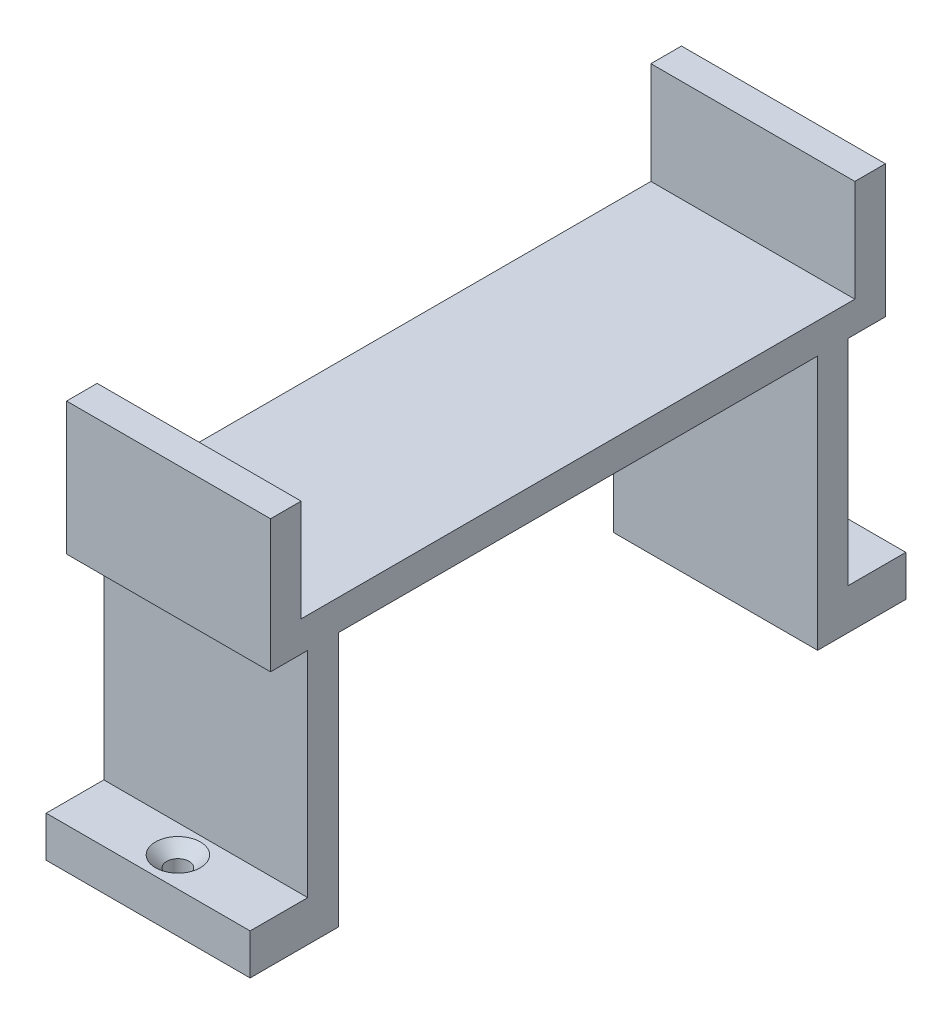
ISO-10303-21;
HEADER;
FILE_DESCRIPTION(('STEP AP214'),'2;1');
FILE_NAME('part.step','',(''),(''),'','','');
FILE_SCHEMA(('AUTOMOTIVE_DESIGN { 1 0 10303 214 1 1 1 1 }'));
ENDSEC;
DATA;
#1=APPLICATION_CONTEXT('core data for automotive mechanical design processes');
#2=APPLICATION_PROTOCOL_DEFINITION('international standard','automotive_design',2000,#1);
#3=PRODUCT_CONTEXT('',#1,'mechanical');
#4=PRODUCT('Part','Part','',(#3));
#5=PRODUCT_RELATED_PRODUCT_CATEGORY('part','',(#4));
#6=PRODUCT_DEFINITION_FORMATION('','',#4);
#7=PRODUCT_DEFINITION_CONTEXT('part definition',#1,'design');
#8=PRODUCT_DEFINITION('design','',#6,#7);
#9=PRODUCT_DEFINITION_SHAPE('','',#8);
#10=(LENGTH_UNIT() NAMED_UNIT(*) SI_UNIT(.MILLI.,.METRE.));
#11=(NAMED_UNIT(*) PLANE_ANGLE_UNIT() SI_UNIT($,.RADIAN.));
#12=(NAMED_UNIT(*) SI_UNIT($,.STERADIAN.) SOLID_ANGLE_UNIT());
#13=UNCERTAINTY_MEASURE_WITH_UNIT(LENGTH_MEASURE(1.E-05),#10,'distance_accuracy_value','');
#14=(GEOMETRIC_REPRESENTATION_CONTEXT(3) GLOBAL_UNCERTAINTY_ASSIGNED_CONTEXT((#13)) GLOBAL_UNIT_ASSIGNED_CONTEXT((#10,
#11,#12)) REPRESENTATION_CONTEXT('',''));
#15=CARTESIAN_POINT('',(0.,0.,0.));
#16=DIRECTION('',(0.,0.,1.));
#17=DIRECTION('',(1.,0.,0.));
#18=AXIS2_PLACEMENT_3D('',#15,#16,#17);
#19=CARTESIAN_POINT('',(10.,19.,30.15));
#20=DIRECTION('',(0.,0.,-1.));
#21=DIRECTION('',(0.,1.,0.));
#22=AXIS2_PLACEMENT_3D('',#19,#20,#21);
#23=PLANE('',#22);
#24=DIRECTION('',(0.,-1.,0.));
#25=VECTOR('',#24,1.);
#26=CARTESIAN_POINT('',(-10.,19.,30.15));
#27=LINE('',#26,#25);
#28=CARTESIAN_POINT('',(-10.,19.,30.15));
#29=VERTEX_POINT('',#28);
#30=CARTESIAN_POINT('',(-10.,6.,30.15));
#31=VERTEX_POINT('',#30);
#32=EDGE_CURVE('E207',#29,#31,#27,.T.);
#33=ORIENTED_EDGE('',*,*,#32,.T.);
#34=DIRECTION('',(-1.,0.,0.));
#35=VECTOR('',#34,1.);
#36=CARTESIAN_POINT('',(0.,6.,30.15));
#37=LINE('',#36,#35);
#38=CARTESIAN_POINT('',(10.,6.,30.15));
#39=VERTEX_POINT('',#38);
#40=EDGE_CURVE('E114',#39,#31,#37,.T.);
#41=ORIENTED_EDGE('',*,*,#40,.F.);
#42=DIRECTION('',(0.,-1.,0.));
#43=VECTOR('',#42,1.);
#44=CARTESIAN_POINT('',(10.,19.,30.15));
#45=LINE('',#44,#43);
#46=CARTESIAN_POINT('',(10.,19.,30.15));
#47=VERTEX_POINT('',#46);
#48=EDGE_CURVE('E297',#47,#39,#45,.T.);
#49=ORIENTED_EDGE('',*,*,#48,.F.);
#50=DIRECTION('',(-1.,0.,0.));
#51=VECTOR('',#50,1.);
#52=CARTESIAN_POINT('',(10.,19.,30.15));
#53=LINE('',#52,#51);
#54=EDGE_CURVE('E220',#47,#29,#53,.T.);
#55=ORIENTED_EDGE('',*,*,#54,.T.);
#56=EDGE_LOOP('',(#33,#41,#49,#55));
#57=FACE_BOUND('',#56,.T.);
#58=ADVANCED_FACE('F43',(#57),#23,.F.);
#59=CARTESIAN_POINT('',(10.,19.,-30.15));
#60=DIRECTION('',(0.,0.,-1.));
#61=DIRECTION('',(-1.,0.,0.));
#62=AXIS2_PLACEMENT_3D('',#59,#60,#61);
#63=PLANE('',#62);
#64=DIRECTION('',(1.,0.,0.));
#65=VECTOR('',#64,1.);
#66=CARTESIAN_POINT('',(10.,6.,-30.15));
#67=LINE('',#66,#65);
#68=CARTESIAN_POINT('',(-10.,6.,-30.15));
#69=VERTEX_POINT('',#68);
#70=CARTESIAN_POINT('',(10.,6.,-30.15));
#71=VERTEX_POINT('',#70);
#72=EDGE_CURVE('E333',#69,#71,#67,.T.);
#73=ORIENTED_EDGE('',*,*,#72,.F.);
#74=DIRECTION('',(0.,-1.,0.));
#75=VECTOR('',#74,1.);
#76=CARTESIAN_POINT('',(-10.,19.,-30.15));
#77=LINE('',#76,#75);
#78=CARTESIAN_POINT('',(-10.,19.,-30.15));
#79=VERTEX_POINT('',#78);
#80=EDGE_CURVE('E197',#79,#69,#77,.T.);
#81=ORIENTED_EDGE('',*,*,#80,.F.);
#82=DIRECTION('',(-1.,0.,0.));
#83=VECTOR('',#82,1.);
#84=CARTESIAN_POINT('',(10.,19.,-30.15));
#85=LINE('',#84,#83);
#86=CARTESIAN_POINT('',(10.,19.,-30.15));
#87=VERTEX_POINT('',#86);
#88=EDGE_CURVE('E214',#87,#79,#85,.T.);
#89=ORIENTED_EDGE('',*,*,#88,.F.);
#90=DIRECTION('',(0.,-1.,0.));
#91=VECTOR('',#90,1.);
#92=CARTESIAN_POINT('',(10.,19.,-30.15));
#93=LINE('',#92,#91);
#94=EDGE_CURVE('E227',#87,#71,#93,.T.);
#95=ORIENTED_EDGE('',*,*,#94,.T.);
#96=EDGE_LOOP('',(#73,#81,#89,#95));
#97=FACE_BOUND('',#96,.T.);
#98=ADVANCED_FACE('F378',(#97),#63,.T.);
#99=CARTESIAN_POINT('',(10.,-19.,30.15));
#100=DIRECTION('',(0.,1.,0.));
#101=DIRECTION('',(0.,0.,1.));
#102=AXIS2_PLACEMENT_3D('',#99,#100,#101);
#103=PLANE('',#102);
#104=CARTESIAN_POINT('',(0.,-19.,-29.4542633059223));
#105=DIRECTION('',(0.,1.,0.));
#106=DIRECTION('',(0.,0.,1.));
#107=AXIS2_PLACEMENT_3D('',#104,#105,#106);
#108=CIRCLE('',#107,1.09999999999999);
#109=CARTESIAN_POINT('',(0.,-19.,-28.3542633059223));
#110=VERTEX_POINT('',#109);
#111=EDGE_CURVE('E308',#110,#110,#108,.T.);
#112=ORIENTED_EDGE('',*,*,#111,.T.);
#113=EDGE_LOOP('',(#112));
#114=FACE_BOUND('',#113,.T.);
#115=DIRECTION('',(0.,0.,-1.));
#116=VECTOR('',#115,1.);
#117=CARTESIAN_POINT('',(10.,-19.,30.15));
#118=LINE('',#117,#116);
#119=CARTESIAN_POINT('',(10.,-19.,-23.5));
#120=VERTEX_POINT('',#119);
#121=CARTESIAN_POINT('',(10.,-19.,-32.15));
#122=VERTEX_POINT('',#121);
#123=EDGE_CURVE('E299',#120,#122,#118,.T.);
#124=ORIENTED_EDGE('',*,*,#123,.F.);
#125=DIRECTION('',(1.,0.,0.));
#126=VECTOR('',#125,1.);
#127=CARTESIAN_POINT('',(-10.,-19.,-23.5));
#128=LINE('',#127,#126);
#129=CARTESIAN_POINT('',(-10.,-19.,-23.5));
#130=VERTEX_POINT('',#129);
#131=EDGE_CURVE('E206',#130,#120,#128,.T.);
#132=ORIENTED_EDGE('',*,*,#131,.F.);
#133=DIRECTION('',(0.,0.,-1.));
#134=VECTOR('',#133,1.);
#135=CARTESIAN_POINT('',(-10.,-19.,30.15));
#136=LINE('',#135,#134);
#137=CARTESIAN_POINT('',(-10.,-19.,-32.15));
#138=VERTEX_POINT('',#137);
#139=EDGE_CURVE('E191',#130,#138,#136,.T.);
#140=ORIENTED_EDGE('',*,*,#139,.T.);
#141=DIRECTION('',(-1.,0.,0.));
#142=VECTOR('',#141,1.);
#143=CARTESIAN_POINT('',(10.,-19.,-32.15));
#144=LINE('',#143,#142);
#145=EDGE_CURVE('E205',#122,#138,#144,.T.);
#146=ORIENTED_EDGE('',*,*,#145,.F.);
#147=EDGE_LOOP('',(#124,#132,#140,#146));
#148=FACE_BOUND('',#147,.T.);
#149=ADVANCED_FACE('F204',(#114,#148),#103,.F.);
#150=CARTESIAN_POINT('',(10.,19.,30.15));
#151=DIRECTION('',(0.,1.,0.));
#152=DIRECTION('',(0.,0.,1.));
#153=AXIS2_PLACEMENT_3D('',#150,#151,#152);
#154=PLANE('',#153);
#155=DIRECTION('',(1.,0.,0.));
#156=VECTOR('',#155,1.);
#157=CARTESIAN_POINT('',(-10.,19.,27.15));
#158=LINE('',#157,#156);
#159=CARTESIAN_POINT('',(-10.,19.,27.15));
#160=VERTEX_POINT('',#159);
#161=CARTESIAN_POINT('',(10.,19.,27.15));
#162=VERTEX_POINT('',#161);
#163=EDGE_CURVE('E277',#160,#162,#158,.T.);
#164=ORIENTED_EDGE('',*,*,#163,.F.);
#165=DIRECTION('',(0.,0.,-1.));
#166=VECTOR('',#165,1.);
#167=CARTESIAN_POINT('',(-10.,19.,30.15));
#168=LINE('',#167,#166);
#169=EDGE_CURVE('E258',#29,#160,#168,.T.);
#170=ORIENTED_EDGE('',*,*,#169,.F.);
#171=ORIENTED_EDGE('',*,*,#54,.F.);
#172=DIRECTION('',(0.,0.,-1.));
#173=VECTOR('',#172,1.);
#174=CARTESIAN_POINT('',(10.,19.,30.15));
#175=LINE('',#174,#173);
#176=EDGE_CURVE('E279',#47,#162,#175,.T.);
#177=ORIENTED_EDGE('',*,*,#176,.T.);
#178=EDGE_LOOP('',(#164,#170,#171,#177));
#179=FACE_BOUND('',#178,.T.);
#180=ADVANCED_FACE('F275',(#179),#154,.T.);
#181=CARTESIAN_POINT('',(10.,19.,32.15));
#182=DIRECTION('',(0.,0.,-1.));
#183=DIRECTION('',(0.,1.,0.));
#184=AXIS2_PLACEMENT_3D('',#181,#182,#183);
#185=PLANE('',#184);
#186=DIRECTION('',(0.,-1.,0.));
#187=VECTOR('',#186,1.);
#188=CARTESIAN_POINT('',(10.,19.,32.15));
#189=LINE('',#188,#187);
#190=CARTESIAN_POINT('',(10.,-15.,32.15));
#191=VERTEX_POINT('',#190);
#192=CARTESIAN_POINT('',(10.,-19.,32.15));
#193=VERTEX_POINT('',#192);
#194=EDGE_CURVE('E266',#191,#193,#189,.T.);
#195=ORIENTED_EDGE('',*,*,#194,.F.);
#196=DIRECTION('',(1.,0.,0.));
#197=VECTOR('',#196,1.);
#198=CARTESIAN_POINT('',(0.,-15.,32.15));
#199=LINE('',#198,#197);
#200=CARTESIAN_POINT('',(-10.,-15.,32.15));
#201=VERTEX_POINT('',#200);
#202=EDGE_CURVE('E307',#201,#191,#199,.T.);
#203=ORIENTED_EDGE('',*,*,#202,.F.);
#204=DIRECTION('',(0.,-1.,0.));
#205=VECTOR('',#204,1.);
#206=CARTESIAN_POINT('',(-10.,19.,32.15));
#207=LINE('',#206,#205);
#208=CARTESIAN_POINT('',(-10.,-19.,32.15));
#209=VERTEX_POINT('',#208);
#210=EDGE_CURVE('E235',#201,#209,#207,.T.);
#211=ORIENTED_EDGE('',*,*,#210,.T.);
#212=DIRECTION('',(-1.,0.,0.));
#213=VECTOR('',#212,1.);
#214=CARTESIAN_POINT('',(10.,-19.,32.15));
#215=LINE('',#214,#213);
#216=EDGE_CURVE('E213',#193,#209,#215,.T.);
#217=ORIENTED_EDGE('',*,*,#216,.F.);
#218=EDGE_LOOP('',(#195,#203,#211,#217));
#219=FACE_BOUND('',#218,.T.);
#220=ADVANCED_FACE('F410',(#219),#185,.F.);
#221=CARTESIAN_POINT('',(0.,-19.,29.2326763826907));
#222=DIRECTION('',(0.,1.,0.));
#223=DIRECTION('',(0.,0.,1.));
#224=AXIS2_PLACEMENT_3D('',#221,#222,#223);
#225=CIRCLE('',#224,1.09999999999999);
#226=CARTESIAN_POINT('',(0.,-19.,30.3326763826907));
#227=VERTEX_POINT('',#226);
#228=EDGE_CURVE('E610',#227,#227,#225,.T.);
#229=ORIENTED_EDGE('',*,*,#228,.T.);
#230=EDGE_LOOP('',(#229));
#231=FACE_BOUND('',#230,.T.);
#232=DIRECTION('',(0.,0.,-1.));
#233=VECTOR('',#232,1.);
#234=CARTESIAN_POINT('',(-10.,-19.,30.15));
#235=LINE('',#234,#233);
#236=CARTESIAN_POINT('',(-10.,-19.,23.5));
#237=VERTEX_POINT('',#236);
#238=EDGE_CURVE('E198',#209,#237,#235,.T.);
#239=ORIENTED_EDGE('',*,*,#238,.T.);
#240=DIRECTION('',(-1.,0.,0.));
#241=VECTOR('',#240,1.);
#242=CARTESIAN_POINT('',(-10.,-19.,23.5));
#243=LINE('',#242,#241);
#244=CARTESIAN_POINT('',(10.,-19.,23.5));
#245=VERTEX_POINT('',#244);
#246=EDGE_CURVE('E340',#245,#237,#243,.T.);
#247=ORIENTED_EDGE('',*,*,#246,.F.);
#248=EDGE_CURVE('E228',#193,#245,#118,.T.);
#249=ORIENTED_EDGE('',*,*,#248,.F.);
#250=ORIENTED_EDGE('',*,*,#216,.T.);
#251=EDGE_LOOP('',(#239,#247,#249,#250));
#252=FACE_BOUND('',#251,.T.);
#253=ADVANCED_FACE('F409',(#231,#252),#103,.F.);
#254=CARTESIAN_POINT('',(10.,19.,-32.15));
#255=DIRECTION('',(0.,0.,-1.));
#256=DIRECTION('',(-1.,0.,0.));
#257=AXIS2_PLACEMENT_3D('',#254,#255,#256);
#258=PLANE('',#257);
#259=DIRECTION('',(-1.,0.,0.));
#260=VECTOR('',#259,1.);
#261=CARTESIAN_POINT('',(10.,-15.,-32.15));
#262=LINE('',#261,#260);
#263=CARTESIAN_POINT('',(10.,-15.,-32.15));
#264=VERTEX_POINT('',#263);
#265=CARTESIAN_POINT('',(-10.,-15.,-32.15));
#266=VERTEX_POINT('',#265);
#267=EDGE_CURVE('E224',#264,#266,#262,.T.);
#268=ORIENTED_EDGE('',*,*,#267,.F.);
#269=DIRECTION('',(0.,-1.,0.));
#270=VECTOR('',#269,1.);
#271=CARTESIAN_POINT('',(10.,19.,-32.15));
#272=LINE('',#271,#270);
#273=EDGE_CURVE('E211',#264,#122,#272,.T.);
#274=ORIENTED_EDGE('',*,*,#273,.T.);
#275=ORIENTED_EDGE('',*,*,#145,.T.);
#276=DIRECTION('',(0.,-1.,0.));
#277=VECTOR('',#276,1.);
#278=CARTESIAN_POINT('',(-10.,19.,-32.15));
#279=LINE('',#278,#277);
#280=EDGE_CURVE('E188',#266,#138,#279,.T.);
#281=ORIENTED_EDGE('',*,*,#280,.F.);
#282=EDGE_LOOP('',(#268,#274,#275,#281));
#283=FACE_BOUND('',#282,.T.);
#284=ADVANCED_FACE('F209',(#283),#258,.T.);
#285=DIRECTION('',(-1.,0.,0.));
#286=VECTOR('',#285,1.);
#287=CARTESIAN_POINT('',(-10.,19.,-27.15));
#288=LINE('',#287,#286);
#289=CARTESIAN_POINT('',(10.,19.,-27.15));
#290=VERTEX_POINT('',#289);
#291=CARTESIAN_POINT('',(-10.,19.,-27.15));
#292=VERTEX_POINT('',#291);
#293=EDGE_CURVE('E284',#290,#292,#288,.T.);
#294=ORIENTED_EDGE('',*,*,#293,.F.);
#295=EDGE_CURVE('E304',#290,#87,#175,.T.);
#296=ORIENTED_EDGE('',*,*,#295,.T.);
#297=ORIENTED_EDGE('',*,*,#88,.T.);
#298=DIRECTION('',(0.,0.,-1.));
#299=VECTOR('',#298,1.);
#300=CARTESIAN_POINT('',(-10.,19.,30.15));
#301=LINE('',#300,#299);
#302=EDGE_CURVE('E256',#292,#79,#301,.T.);
#303=ORIENTED_EDGE('',*,*,#302,.F.);
#304=EDGE_LOOP('',(#294,#296,#297,#303));
#305=FACE_BOUND('',#304,.T.);
#306=ADVANCED_FACE('F372',(#305),#154,.T.);
#307=CARTESIAN_POINT('',(10.,0.,0.));
#308=DIRECTION('',(1.,0.,0.));
#309=DIRECTION('',(0.,0.,-1.));
#310=AXIS2_PLACEMENT_3D('',#307,#308,#309);
#311=PLANE('',#310);
#312=DIRECTION('',(0.,0.,1.));
#313=VECTOR('',#312,1.);
#314=CARTESIAN_POINT('',(10.,6.,26.5));
#315=LINE('',#314,#313);
#316=CARTESIAN_POINT('',(10.,6.,26.5));
#317=VERTEX_POINT('',#316);
#318=EDGE_CURVE('E122',#317,#39,#315,.T.);
#319=ORIENTED_EDGE('',*,*,#318,.F.);
#320=DIRECTION('',(0.,1.,0.));
#321=VECTOR('',#320,1.);
#322=CARTESIAN_POINT('',(10.,6.,26.5));
#323=LINE('',#322,#321);
#324=CARTESIAN_POINT('',(10.,-15.,26.5));
#325=VERTEX_POINT('',#324);
#326=EDGE_CURVE('E326',#325,#317,#323,.T.);
#327=ORIENTED_EDGE('',*,*,#326,.F.);
#328=DIRECTION('',(0.,0.,1.));
#329=VECTOR('',#328,1.);
#330=CARTESIAN_POINT('',(10.,-15.,26.5));
#331=LINE('',#330,#329);
#332=EDGE_CURVE('E234',#325,#191,#331,.T.);
#333=ORIENTED_EDGE('',*,*,#332,.T.);
#334=ORIENTED_EDGE('',*,*,#194,.T.);
#335=ORIENTED_EDGE('',*,*,#248,.T.);
#336=DIRECTION('',(0.,-1.,0.));
#337=VECTOR('',#336,1.);
#338=CARTESIAN_POINT('',(10.,6.00000000000001,23.5));
#339=LINE('',#338,#337);
#340=CARTESIAN_POINT('',(10.,6.00000000000001,23.5));
#341=VERTEX_POINT('',#340);
#342=EDGE_CURVE('E349',#341,#245,#339,.T.);
#343=ORIENTED_EDGE('',*,*,#342,.F.);
#344=DIRECTION('',(0.,0.,1.));
#345=VECTOR('',#344,1.);
#346=CARTESIAN_POINT('',(10.,6.00000000000001,-23.5));
#347=LINE('',#346,#345);
#348=CARTESIAN_POINT('',(10.,6.00000000000001,-23.5));
#349=VERTEX_POINT('',#348);
#350=EDGE_CURVE('E342',#349,#341,#347,.T.);
#351=ORIENTED_EDGE('',*,*,#350,.F.);
#352=DIRECTION('',(0.,-1.,0.));
#353=VECTOR('',#352,1.);
#354=CARTESIAN_POINT('',(10.,6.00000000000001,-23.5));
#355=LINE('',#354,#353);
#356=EDGE_CURVE('E289',#349,#120,#355,.T.);
#357=ORIENTED_EDGE('',*,*,#356,.T.);
#358=ORIENTED_EDGE('',*,*,#123,.T.);
#359=ORIENTED_EDGE('',*,*,#273,.F.);
#360=DIRECTION('',(0.,0.,-1.));
#361=VECTOR('',#360,1.);
#362=CARTESIAN_POINT('',(10.,-15.,-26.5));
#363=LINE('',#362,#361);
#364=CARTESIAN_POINT('',(10.,-15.,-26.5));
#365=VERTEX_POINT('',#364);
#366=EDGE_CURVE('E248',#365,#264,#363,.T.);
#367=ORIENTED_EDGE('',*,*,#366,.F.);
#368=DIRECTION('',(0.,-1.,0.));
#369=VECTOR('',#368,1.);
#370=CARTESIAN_POINT('',(10.,6.,-26.5));
#371=LINE('',#370,#369);
#372=CARTESIAN_POINT('',(10.,6.,-26.5));
#373=VERTEX_POINT('',#372);
#374=EDGE_CURVE('E331',#373,#365,#371,.T.);
#375=ORIENTED_EDGE('',*,*,#374,.F.);
#376=DIRECTION('',(0.,0.,-1.));
#377=VECTOR('',#376,1.);
#378=CARTESIAN_POINT('',(10.,6.,-26.5));
#379=LINE('',#378,#377);
#380=EDGE_CURVE('E253',#373,#71,#379,.T.);
#381=ORIENTED_EDGE('',*,*,#380,.T.);
#382=ORIENTED_EDGE('',*,*,#94,.F.);
#383=ORIENTED_EDGE('',*,*,#295,.F.);
#384=DIRECTION('',(0.,1.,0.));
#385=VECTOR('',#384,1.);
#386=CARTESIAN_POINT('',(10.,9.,-27.15));
#387=LINE('',#386,#385);
#388=CARTESIAN_POINT('',(10.,9.,-27.15));
#389=VERTEX_POINT('',#388);
#390=EDGE_CURVE('E294',#389,#290,#387,.T.);
#391=ORIENTED_EDGE('',*,*,#390,.F.);
#392=DIRECTION('',(0.,0.,-1.));
#393=VECTOR('',#392,1.);
#394=CARTESIAN_POINT('',(10.,9.,-27.15));
#395=LINE('',#394,#393);
#396=CARTESIAN_POINT('',(10.,9.,27.15));
#397=VERTEX_POINT('',#396);
#398=EDGE_CURVE('E283',#397,#389,#395,.T.);
#399=ORIENTED_EDGE('',*,*,#398,.F.);
#400=DIRECTION('',(0.,1.,0.));
#401=VECTOR('',#400,1.);
#402=CARTESIAN_POINT('',(10.,9.,27.15));
#403=LINE('',#402,#401);
#404=EDGE_CURVE('E237',#397,#162,#403,.T.);
#405=ORIENTED_EDGE('',*,*,#404,.T.);
#406=ORIENTED_EDGE('',*,*,#176,.F.);
#407=ORIENTED_EDGE('',*,*,#48,.T.);
#408=EDGE_LOOP('',(#319,#327,#333,#334,#335,#343,#351,#357,#358,#359,#367,#375,#381,#382,#383,
#391,#399,#405,#406,#407));
#409=FACE_BOUND('',#408,.T.);
#410=ADVANCED_FACE('F363',(#409),#311,.T.);
#411=CARTESIAN_POINT('',(-10.,0.,0.));
#412=DIRECTION('',(1.,0.,0.));
#413=DIRECTION('',(0.,0.,-1.));
#414=AXIS2_PLACEMENT_3D('',#411,#412,#413);
#415=PLANE('',#414);
#416=DIRECTION('',(0.,-1.,0.));
#417=VECTOR('',#416,1.);
#418=CARTESIAN_POINT('',(-10.,0.,26.5));
#419=LINE('',#418,#417);
#420=CARTESIAN_POINT('',(-10.,6.,26.5));
#421=VERTEX_POINT('',#420);
#422=CARTESIAN_POINT('',(-10.,-15.,26.5));
#423=VERTEX_POINT('',#422);
#424=EDGE_CURVE('E229',#421,#423,#419,.T.);
#425=ORIENTED_EDGE('',*,*,#424,.F.);
#426=DIRECTION('',(0.,0.,1.));
#427=VECTOR('',#426,1.);
#428=CARTESIAN_POINT('',(-10.,6.,0.));
#429=LINE('',#428,#427);
#430=EDGE_CURVE('E47',#421,#31,#429,.T.);
#431=ORIENTED_EDGE('',*,*,#430,.T.);
#432=ORIENTED_EDGE('',*,*,#32,.F.);
#433=ORIENTED_EDGE('',*,*,#169,.T.);
#434=DIRECTION('',(0.,-1.,0.));
#435=VECTOR('',#434,1.);
#436=CARTESIAN_POINT('',(-10.,0.,27.15));
#437=LINE('',#436,#435);
#438=CARTESIAN_POINT('',(-10.,9.,27.15));
#439=VERTEX_POINT('',#438);
#440=EDGE_CURVE('E244',#160,#439,#437,.T.);
#441=ORIENTED_EDGE('',*,*,#440,.T.);
#442=DIRECTION('',(0.,0.,1.));
#443=VECTOR('',#442,1.);
#444=CARTESIAN_POINT('',(-10.,9.,0.));
#445=LINE('',#444,#443);
#446=CARTESIAN_POINT('',(-10.,9.,-27.15));
#447=VERTEX_POINT('',#446);
#448=EDGE_CURVE('E217',#447,#439,#445,.T.);
#449=ORIENTED_EDGE('',*,*,#448,.F.);
#450=DIRECTION('',(0.,1.,0.));
#451=VECTOR('',#450,1.);
#452=CARTESIAN_POINT('',(-10.,0.,-27.15));
#453=LINE('',#452,#451);
#454=EDGE_CURVE('E259',#447,#292,#453,.T.);
#455=ORIENTED_EDGE('',*,*,#454,.T.);
#456=ORIENTED_EDGE('',*,*,#302,.T.);
#457=ORIENTED_EDGE('',*,*,#80,.T.);
#458=DIRECTION('',(0.,0.,-1.));
#459=VECTOR('',#458,1.);
#460=CARTESIAN_POINT('',(-10.,6.,-26.5));
#461=LINE('',#460,#459);
#462=CARTESIAN_POINT('',(-10.,6.,-26.5));
#463=VERTEX_POINT('',#462);
#464=EDGE_CURVE('E247',#463,#69,#461,.T.);
#465=ORIENTED_EDGE('',*,*,#464,.F.);
#466=DIRECTION('',(0.,1.,0.));
#467=VECTOR('',#466,1.);
#468=CARTESIAN_POINT('',(-10.,0.,-26.5));
#469=LINE('',#468,#467);
#470=CARTESIAN_POINT('',(-10.,-15.,-26.5));
#471=VERTEX_POINT('',#470);
#472=EDGE_CURVE('E249',#471,#463,#469,.T.);
#473=ORIENTED_EDGE('',*,*,#472,.F.);
#474=DIRECTION('',(0.,0.,-1.));
#475=VECTOR('',#474,1.);
#476=CARTESIAN_POINT('',(-10.,-15.,0.));
#477=LINE('',#476,#475);
#478=EDGE_CURVE('E193',#471,#266,#477,.T.);
#479=ORIENTED_EDGE('',*,*,#478,.T.);
#480=ORIENTED_EDGE('',*,*,#280,.T.);
#481=ORIENTED_EDGE('',*,*,#139,.F.);
#482=DIRECTION('',(0.,1.,0.));
#483=VECTOR('',#482,1.);
#484=CARTESIAN_POINT('',(-10.,0.,-23.5));
#485=LINE('',#484,#483);
#486=CARTESIAN_POINT('',(-10.,6.00000000000001,-23.5));
#487=VERTEX_POINT('',#486);
#488=EDGE_CURVE('E12',#130,#487,#485,.T.);
#489=ORIENTED_EDGE('',*,*,#488,.T.);
#490=DIRECTION('',(0.,0.,1.));
#491=VECTOR('',#490,1.);
#492=CARTESIAN_POINT('',(-10.,6.00000000000001,0.));
#493=LINE('',#492,#491);
#494=CARTESIAN_POINT('',(-10.,6.00000000000001,23.5));
#495=VERTEX_POINT('',#494);
#496=EDGE_CURVE('E242',#487,#495,#493,.T.);
#497=ORIENTED_EDGE('',*,*,#496,.T.);
#498=DIRECTION('',(0.,-1.,0.));
#499=VECTOR('',#498,1.);
#500=CARTESIAN_POINT('',(-10.,0.,23.5));
#501=LINE('',#500,#499);
#502=EDGE_CURVE('E52',#495,#237,#501,.T.);
#503=ORIENTED_EDGE('',*,*,#502,.T.);
#504=ORIENTED_EDGE('',*,*,#238,.F.);
#505=ORIENTED_EDGE('',*,*,#210,.F.);
#506=DIRECTION('',(0.,0.,1.));
#507=VECTOR('',#506,1.);
#508=CARTESIAN_POINT('',(-10.,-15.,26.5));
#509=LINE('',#508,#507);
#510=EDGE_CURVE('E232',#423,#201,#509,.T.);
#511=ORIENTED_EDGE('',*,*,#510,.F.);
#512=EDGE_LOOP('',(#425,#431,#432,#433,#441,#449,#455,#456,#457,#465,#473,#479,#480,#481,#489,
#497,#503,#504,#505,#511));
#513=FACE_BOUND('',#512,.T.);
#514=ADVANCED_FACE('F45',(#513),#415,.F.);
#515=CARTESIAN_POINT('',(-10.,9.,27.15));
#516=DIRECTION('',(0.,0.,1.));
#517=DIRECTION('',(1.,0.,0.));
#518=AXIS2_PLACEMENT_3D('',#515,#516,#517);
#519=PLANE('',#518);
#520=ORIENTED_EDGE('',*,*,#163,.T.);
#521=ORIENTED_EDGE('',*,*,#404,.F.);
#522=DIRECTION('',(1.,0.,0.));
#523=VECTOR('',#522,1.);
#524=CARTESIAN_POINT('',(-10.,9.,27.15));
#525=LINE('',#524,#523);
#526=EDGE_CURVE('E296',#439,#397,#525,.T.);
#527=ORIENTED_EDGE('',*,*,#526,.F.);
#528=ORIENTED_EDGE('',*,*,#440,.F.);
#529=EDGE_LOOP('',(#520,#521,#527,#528));
#530=FACE_BOUND('',#529,.T.);
#531=ADVANCED_FACE('F361',(#530),#519,.F.);
#532=CARTESIAN_POINT('',(-10.,9.,-27.15));
#533=DIRECTION('',(0.,0.,-1.));
#534=DIRECTION('',(-1.,0.,0.));
#535=AXIS2_PLACEMENT_3D('',#532,#533,#534);
#536=PLANE('',#535);
#537=DIRECTION('',(-1.,0.,0.));
#538=VECTOR('',#537,1.);
#539=CARTESIAN_POINT('',(-10.,9.,-27.15));
#540=LINE('',#539,#538);
#541=EDGE_CURVE('E287',#389,#447,#540,.T.);
#542=ORIENTED_EDGE('',*,*,#541,.F.);
#543=ORIENTED_EDGE('',*,*,#390,.T.);
#544=ORIENTED_EDGE('',*,*,#293,.T.);
#545=ORIENTED_EDGE('',*,*,#454,.F.);
#546=EDGE_LOOP('',(#542,#543,#544,#545));
#547=FACE_BOUND('',#546,.T.);
#548=ADVANCED_FACE('F368',(#547),#536,.F.);
#549=CARTESIAN_POINT('',(0.,9.,0.));
#550=DIRECTION('',(0.,1.,0.));
#551=DIRECTION('',(0.,0.,1.));
#552=AXIS2_PLACEMENT_3D('',#549,#550,#551);
#553=PLANE('',#552);
#554=ORIENTED_EDGE('',*,*,#448,.T.);
#555=ORIENTED_EDGE('',*,*,#526,.T.);
#556=ORIENTED_EDGE('',*,*,#398,.T.);
#557=ORIENTED_EDGE('',*,*,#541,.T.);
#558=EDGE_LOOP('',(#554,#555,#556,#557));
#559=FACE_BOUND('',#558,.T.);
#560=ADVANCED_FACE('F357',(#559),#553,.T.);
#561=CARTESIAN_POINT('',(-10.,6.00000000000001,-23.5));
#562=DIRECTION('',(0.,0.,-1.));
#563=DIRECTION('',(-1.,0.,0.));
#564=AXIS2_PLACEMENT_3D('',#561,#562,#563);
#565=PLANE('',#564);
#566=ORIENTED_EDGE('',*,*,#131,.T.);
#567=ORIENTED_EDGE('',*,*,#356,.F.);
#568=DIRECTION('',(1.,0.,0.));
#569=VECTOR('',#568,1.);
#570=CARTESIAN_POINT('',(-10.,6.00000000000001,-23.5));
#571=LINE('',#570,#569);
#572=EDGE_CURVE('E347',#487,#349,#571,.T.);
#573=ORIENTED_EDGE('',*,*,#572,.F.);
#574=ORIENTED_EDGE('',*,*,#488,.F.);
#575=EDGE_LOOP('',(#566,#567,#573,#574));
#576=FACE_BOUND('',#575,.T.);
#577=ADVANCED_FACE('F439',(#576),#565,.F.);
#578=CARTESIAN_POINT('',(-10.,6.00000000000001,23.5));
#579=DIRECTION('',(0.,0.,1.));
#580=DIRECTION('',(1.,0.,0.));
#581=AXIS2_PLACEMENT_3D('',#578,#579,#580);
#582=PLANE('',#581);
#583=DIRECTION('',(-1.,0.,0.));
#584=VECTOR('',#583,1.);
#585=CARTESIAN_POINT('',(-10.,6.00000000000001,23.5));
#586=LINE('',#585,#584);
#587=EDGE_CURVE('E345',#341,#495,#586,.T.);
#588=ORIENTED_EDGE('',*,*,#587,.F.);
#589=ORIENTED_EDGE('',*,*,#342,.T.);
#590=ORIENTED_EDGE('',*,*,#246,.T.);
#591=ORIENTED_EDGE('',*,*,#502,.F.);
#592=EDGE_LOOP('',(#588,#589,#590,#591));
#593=FACE_BOUND('',#592,.T.);
#594=ADVANCED_FACE('F440',(#593),#582,.F.);
#595=CARTESIAN_POINT('',(0.,6.00000000000001,0.));
#596=DIRECTION('',(0.,1.,0.));
#597=DIRECTION('',(0.,0.,1.));
#598=AXIS2_PLACEMENT_3D('',#595,#596,#597);
#599=PLANE('',#598);
#600=ORIENTED_EDGE('',*,*,#572,.T.);
#601=ORIENTED_EDGE('',*,*,#350,.T.);
#602=ORIENTED_EDGE('',*,*,#587,.T.);
#603=ORIENTED_EDGE('',*,*,#496,.F.);
#604=EDGE_LOOP('',(#600,#601,#602,#603));
#605=FACE_BOUND('',#604,.T.);
#606=ADVANCED_FACE('F443',(#605),#599,.F.);
#607=CARTESIAN_POINT('',(10.,6.,-26.5));
#608=DIRECTION('',(0.,1.,0.));
#609=DIRECTION('',(0.,0.,1.));
#610=AXIS2_PLACEMENT_3D('',#607,#608,#609);
#611=PLANE('',#610);
#612=ORIENTED_EDGE('',*,*,#72,.T.);
#613=ORIENTED_EDGE('',*,*,#380,.F.);
#614=DIRECTION('',(1.,0.,0.));
#615=VECTOR('',#614,1.);
#616=CARTESIAN_POINT('',(10.,6.,-26.5));
#617=LINE('',#616,#615);
#618=EDGE_CURVE('E251',#463,#373,#617,.T.);
#619=ORIENTED_EDGE('',*,*,#618,.F.);
#620=ORIENTED_EDGE('',*,*,#464,.T.);
#621=EDGE_LOOP('',(#612,#613,#619,#620));
#622=FACE_BOUND('',#621,.T.);
#623=ADVANCED_FACE('F380',(#622),#611,.F.);
#624=CARTESIAN_POINT('',(10.,-15.,-26.5));
#625=DIRECTION('',(0.,-1.,0.));
#626=DIRECTION('',(1.,0.,0.));
#627=AXIS2_PLACEMENT_3D('',#624,#625,#626);
#628=PLANE('',#627);
#629=CARTESIAN_POINT('',(0.,-15.,-29.4542633059223));
#630=DIRECTION('',(0.,1.,0.));
#631=DIRECTION('',(0.,0.,1.));
#632=AXIS2_PLACEMENT_3D('',#629,#630,#631);
#633=CIRCLE('',#632,2.2);
#634=CARTESIAN_POINT('',(0.,-15.,-27.2542633059223));
#635=VERTEX_POINT('',#634);
#636=EDGE_CURVE('E320',#635,#635,#633,.T.);
#637=ORIENTED_EDGE('',*,*,#636,.F.);
#638=EDGE_LOOP('',(#637));
#639=FACE_BOUND('',#638,.T.);
#640=ORIENTED_EDGE('',*,*,#267,.T.);
#641=ORIENTED_EDGE('',*,*,#478,.F.);
#642=DIRECTION('',(-1.,0.,0.));
#643=VECTOR('',#642,1.);
#644=CARTESIAN_POINT('',(10.,-15.,-26.5));
#645=LINE('',#644,#643);
#646=EDGE_CURVE('E69',#365,#471,#645,.T.);
#647=ORIENTED_EDGE('',*,*,#646,.F.);
#648=ORIENTED_EDGE('',*,*,#366,.T.);
#649=EDGE_LOOP('',(#640,#641,#647,#648));
#650=FACE_BOUND('',#649,.T.);
#651=ADVANCED_FACE('F387',(#639,#650),#628,.F.);
#652=CARTESIAN_POINT('',(0.,0.,-26.5));
#653=DIRECTION('',(0.,0.,-1.));
#654=DIRECTION('',(-1.,0.,0.));
#655=AXIS2_PLACEMENT_3D('',#652,#653,#654);
#656=PLANE('',#655);
#657=ORIENTED_EDGE('',*,*,#374,.T.);
#658=ORIENTED_EDGE('',*,*,#646,.T.);
#659=ORIENTED_EDGE('',*,*,#472,.T.);
#660=ORIENTED_EDGE('',*,*,#618,.T.);
#661=EDGE_LOOP('',(#657,#658,#659,#660));
#662=FACE_BOUND('',#661,.T.);
#663=ADVANCED_FACE('F384',(#662),#656,.T.);
#664=CARTESIAN_POINT('',(0.,6.,26.5));
#665=DIRECTION('',(0.,1.,0.));
#666=DIRECTION('',(0.,0.,1.));
#667=AXIS2_PLACEMENT_3D('',#664,#665,#666);
#668=PLANE('',#667);
#669=ORIENTED_EDGE('',*,*,#40,.T.);
#670=ORIENTED_EDGE('',*,*,#430,.F.);
#671=DIRECTION('',(-1.,0.,0.));
#672=VECTOR('',#671,1.);
#673=CARTESIAN_POINT('',(0.,6.,26.5));
#674=LINE('',#673,#672);
#675=EDGE_CURVE('E60',#317,#421,#674,.T.);
#676=ORIENTED_EDGE('',*,*,#675,.F.);
#677=ORIENTED_EDGE('',*,*,#318,.T.);
#678=EDGE_LOOP('',(#669,#670,#676,#677));
#679=FACE_BOUND('',#678,.T.);
#680=ADVANCED_FACE('F386',(#679),#668,.F.);
#681=CARTESIAN_POINT('',(0.,-15.,26.5));
#682=DIRECTION('',(0.,-1.,0.));
#683=DIRECTION('',(1.,0.,0.));
#684=AXIS2_PLACEMENT_3D('',#681,#682,#683);
#685=PLANE('',#684);
#686=CARTESIAN_POINT('',(0.,-15.,29.2326763826907));
#687=DIRECTION('',(0.,1.,0.));
#688=DIRECTION('',(0.,0.,1.));
#689=AXIS2_PLACEMENT_3D('',#686,#687,#688);
#690=CIRCLE('',#689,2.2);
#691=CARTESIAN_POINT('',(0.,-15.,31.4326763826907));
#692=VERTEX_POINT('',#691);
#693=EDGE_CURVE('E608',#692,#692,#690,.T.);
#694=ORIENTED_EDGE('',*,*,#693,.F.);
#695=EDGE_LOOP('',(#694));
#696=FACE_BOUND('',#695,.T.);
#697=ORIENTED_EDGE('',*,*,#202,.T.);
#698=ORIENTED_EDGE('',*,*,#332,.F.);
#699=DIRECTION('',(1.,0.,0.));
#700=VECTOR('',#699,1.);
#701=CARTESIAN_POINT('',(0.,-15.,26.5));
#702=LINE('',#701,#700);
#703=EDGE_CURVE('E231',#423,#325,#702,.T.);
#704=ORIENTED_EDGE('',*,*,#703,.F.);
#705=ORIENTED_EDGE('',*,*,#510,.T.);
#706=EDGE_LOOP('',(#697,#698,#704,#705));
#707=FACE_BOUND('',#706,.T.);
#708=ADVANCED_FACE('F393',(#696,#707),#685,.F.);
#709=CARTESIAN_POINT('',(0.,0.,26.5));
#710=DIRECTION('',(0.,0.,1.));
#711=DIRECTION('',(1.,0.,0.));
#712=AXIS2_PLACEMENT_3D('',#709,#710,#711);
#713=PLANE('',#712);
#714=ORIENTED_EDGE('',*,*,#424,.T.);
#715=ORIENTED_EDGE('',*,*,#703,.T.);
#716=ORIENTED_EDGE('',*,*,#326,.T.);
#717=ORIENTED_EDGE('',*,*,#675,.T.);
#718=EDGE_LOOP('',(#714,#715,#716,#717));
#719=FACE_BOUND('',#718,.T.);
#720=ADVANCED_FACE('F551',(#719),#713,.T.);
#721=CARTESIAN_POINT('',(0.,-15.,-29.4542633059223));
#722=DIRECTION('',(0.,1.,0.));
#723=DIRECTION('',(0.,0.,1.));
#724=AXIS2_PLACEMENT_3D('',#721,#722,#723);
#725=CYLINDRICAL_SURFACE('',#724,1.09999999999999);
#726=ORIENTED_EDGE('',*,*,#111,.F.);
#727=EDGE_LOOP('',(#726));
#728=FACE_BOUND('',#727,.T.);
#729=CARTESIAN_POINT('',(0.,-16.1,-29.4542633059223));
#730=DIRECTION('',(0.,1.,0.));
#731=DIRECTION('',(0.,0.,1.));
#732=AXIS2_PLACEMENT_3D('',#729,#730,#731);
#733=CIRCLE('',#732,1.09999999999999);
#734=CARTESIAN_POINT('',(0.,-16.1,-28.3542633059223));
#735=VERTEX_POINT('',#734);
#736=EDGE_CURVE('E315',#735,#735,#733,.T.);
#737=ORIENTED_EDGE('',*,*,#736,.T.);
#738=EDGE_LOOP('',(#737));
#739=FACE_BOUND('',#738,.T.);
#740=ADVANCED_FACE('F558',(#728,#739),#725,.F.);
#741=CARTESIAN_POINT('',(0.,-15.,-29.4542633059223));
#742=DIRECTION('',(0.,1.,0.));
#743=DIRECTION('',(0.,0.,1.));
#744=AXIS2_PLACEMENT_3D('',#741,#742,#743);
#745=CONICAL_SURFACE('',#744,2.2,0.785398163397458);
#746=ORIENTED_EDGE('',*,*,#736,.F.);
#747=EDGE_LOOP('',(#746));
#748=FACE_BOUND('',#747,.T.);
#749=ORIENTED_EDGE('',*,*,#636,.T.);
#750=EDGE_LOOP('',(#749));
#751=FACE_BOUND('',#750,.T.);
#752=ADVANCED_FACE('F566',(#748,#751),#745,.F.);
#753=CARTESIAN_POINT('',(0.,-15.,29.2326763826907));
#754=DIRECTION('',(0.,1.,0.));
#755=DIRECTION('',(0.,0.,1.));
#756=AXIS2_PLACEMENT_3D('',#753,#754,#755);
#757=CYLINDRICAL_SURFACE('',#756,1.09999999999999);
#758=ORIENTED_EDGE('',*,*,#228,.F.);
#759=EDGE_LOOP('',(#758));
#760=FACE_BOUND('',#759,.T.);
#761=CARTESIAN_POINT('',(0.,-16.1,29.2326763826907));
#762=DIRECTION('',(0.,1.,0.));
#763=DIRECTION('',(0.,0.,1.));
#764=AXIS2_PLACEMENT_3D('',#761,#762,#763);
#765=CIRCLE('',#764,1.09999999999999);
#766=CARTESIAN_POINT('',(0.,-16.1,30.3326763826907));
#767=VERTEX_POINT('',#766);
#768=EDGE_CURVE('E605',#767,#767,#765,.T.);
#769=ORIENTED_EDGE('',*,*,#768,.T.);
#770=EDGE_LOOP('',(#769));
#771=FACE_BOUND('',#770,.T.);
#772=ADVANCED_FACE('F575',(#760,#771),#757,.F.);
#773=CARTESIAN_POINT('',(0.,-15.,29.2326763826907));
#774=DIRECTION('',(0.,1.,0.));
#775=DIRECTION('',(0.,0.,1.));
#776=AXIS2_PLACEMENT_3D('',#773,#774,#775);
#777=CONICAL_SURFACE('',#776,2.2,0.785398163397458);
#778=ORIENTED_EDGE('',*,*,#768,.F.);
#779=EDGE_LOOP('',(#778));
#780=FACE_BOUND('',#779,.T.);
#781=ORIENTED_EDGE('',*,*,#693,.T.);
#782=EDGE_LOOP('',(#781));
#783=FACE_BOUND('',#782,.T.);
#784=ADVANCED_FACE('F584',(#780,#783),#777,.F.);
#785=CLOSED_SHELL('',(#58,#98,#149,#180,#220,#253,#284,#306,#410,#514,#531,#548,#560,#577,#594,
#606,#623,#651,#663,#680,#708,#720,#740,#752,#772,#784));
#786=MANIFOLD_SOLID_BREP('B2',#785);
#787=ADVANCED_BREP_SHAPE_REPRESENTATION('',(#18,#786),#14);
#788=SHAPE_DEFINITION_REPRESENTATION(#9,#787);
ENDSEC;
END-ISO-10303-21;
